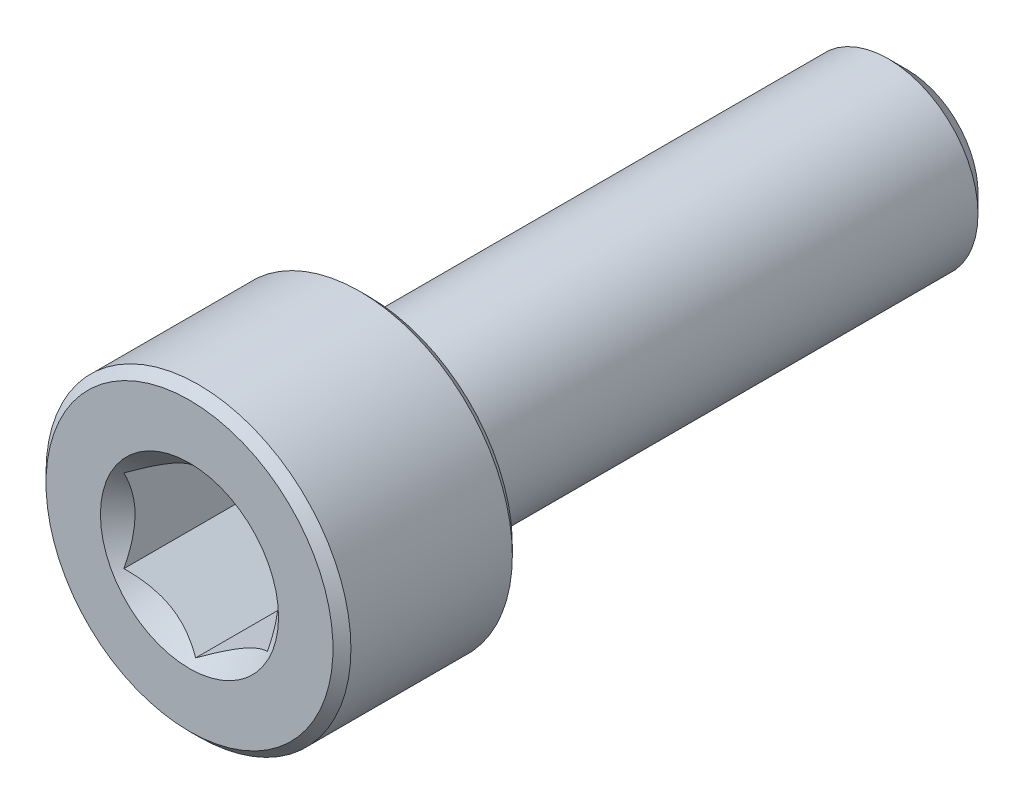
ISO-10303-21;
HEADER;
FILE_DESCRIPTION(('STEP AP214'),'2;1');
FILE_NAME('part.step','',(''),(''),'','','');
FILE_SCHEMA(('AUTOMOTIVE_DESIGN { 1 0 10303 214 1 1 1 1 }'));
ENDSEC;
DATA;
#1=APPLICATION_CONTEXT('core data for automotive mechanical design processes');
#2=APPLICATION_PROTOCOL_DEFINITION('international standard','automotive_design',2000,#1);
#3=PRODUCT_CONTEXT('',#1,'mechanical');
#4=PRODUCT('Part','Part','',(#3));
#5=PRODUCT_RELATED_PRODUCT_CATEGORY('part','',(#4));
#6=PRODUCT_DEFINITION_FORMATION('','',#4);
#7=PRODUCT_DEFINITION_CONTEXT('part definition',#1,'design');
#8=PRODUCT_DEFINITION('design','',#6,#7);
#9=PRODUCT_DEFINITION_SHAPE('','',#8);
#10=(LENGTH_UNIT() NAMED_UNIT(*) SI_UNIT(.MILLI.,.METRE.));
#11=(NAMED_UNIT(*) PLANE_ANGLE_UNIT() SI_UNIT($,.RADIAN.));
#12=(NAMED_UNIT(*) SI_UNIT($,.STERADIAN.) SOLID_ANGLE_UNIT());
#13=UNCERTAINTY_MEASURE_WITH_UNIT(LENGTH_MEASURE(1.E-05),#10,'distance_accuracy_value','');
#14=(GEOMETRIC_REPRESENTATION_CONTEXT(3) GLOBAL_UNCERTAINTY_ASSIGNED_CONTEXT((#13)) GLOBAL_UNIT_ASSIGNED_CONTEXT((#10,
#11,#12)) REPRESENTATION_CONTEXT('',''));
#15=CARTESIAN_POINT('',(0.,0.,0.));
#16=DIRECTION('',(0.,0.,1.));
#17=DIRECTION('',(1.,0.,0.));
#18=AXIS2_PLACEMENT_3D('',#15,#16,#17);
#19=CARTESIAN_POINT('',(0.,1.98038475772934,-10.));
#20=DIRECTION('',(0.,0.,-1.));
#21=DIRECTION('',(0.,1.,0.));
#22=AXIS2_PLACEMENT_3D('',#19,#20,#21);
#23=PLANE('',#22);
#24=CARTESIAN_POINT('',(0.,0.,-10.));
#25=DIRECTION('',(0.,0.,-1.));
#26=DIRECTION('',(0.,1.,0.));
#27=AXIS2_PLACEMENT_3D('',#24,#25,#26);
#28=CIRCLE('',#27,1.98038475772934);
#29=CARTESIAN_POINT('',(0.,1.98038475772934,-10.));
#30=VERTEX_POINT('',#29);
#31=EDGE_CURVE('E52',#30,#30,#28,.T.);
#32=ORIENTED_EDGE('',*,*,#31,.T.);
#33=EDGE_LOOP('',(#32));
#34=FACE_BOUND('',#33,.T.);
#35=ADVANCED_FACE('F39',(#34),#23,.T.);
#36=CARTESIAN_POINT('',(0.,0.,-10.));
#37=DIRECTION('',(0.,0.,1.));
#38=DIRECTION('',(0.,-1.,0.));
#39=AXIS2_PLACEMENT_3D('',#36,#37,#38);
#40=CONICAL_SURFACE('',#39,1.98038475772934,0.785398163397445);
#41=CARTESIAN_POINT('',(0.,0.,-9.48038475772933));
#42=DIRECTION('',(0.,0.,-1.));
#43=DIRECTION('',(0.,1.,0.));
#44=AXIS2_PLACEMENT_3D('',#41,#42,#43);
#45=CIRCLE('',#44,2.5);
#46=CARTESIAN_POINT('',(0.,2.5,-9.48038475772933));
#47=VERTEX_POINT('',#46);
#48=EDGE_CURVE('E155',#47,#47,#45,.T.);
#49=ORIENTED_EDGE('',*,*,#48,.T.);
#50=EDGE_LOOP('',(#49));
#51=FACE_BOUND('',#50,.T.);
#52=ORIENTED_EDGE('',*,*,#31,.F.);
#53=EDGE_LOOP('',(#52));
#54=FACE_BOUND('',#53,.T.);
#55=ADVANCED_FACE('F161',(#51,#54),#40,.T.);
#56=CARTESIAN_POINT('',(0.,0.,-10.));
#57=DIRECTION('',(0.,0.,-1.));
#58=DIRECTION('',(0.,1.,0.));
#59=AXIS2_PLACEMENT_3D('',#56,#57,#58);
#60=CYLINDRICAL_SURFACE('',#59,2.5);
#61=CARTESIAN_POINT('',(0.,0.,4.75));
#62=DIRECTION('',(0.,0.,-1.));
#63=DIRECTION('',(0.,1.,0.));
#64=AXIS2_PLACEMENT_3D('',#61,#62,#63);
#65=CIRCLE('',#64,2.5);
#66=CARTESIAN_POINT('',(0.,2.5,4.75));
#67=VERTEX_POINT('',#66);
#68=EDGE_CURVE('E152',#67,#67,#65,.T.);
#69=ORIENTED_EDGE('',*,*,#68,.T.);
#70=EDGE_LOOP('',(#69));
#71=FACE_BOUND('',#70,.T.);
#72=ORIENTED_EDGE('',*,*,#48,.F.);
#73=EDGE_LOOP('',(#72));
#74=FACE_BOUND('',#73,.T.);
#75=ADVANCED_FACE('F163',(#71,#74),#60,.T.);
#76=CARTESIAN_POINT('',(0.,0.,4.75));
#77=DIRECTION('',(0.,0.,-1.));
#78=DIRECTION('',(0.,1.,0.));
#79=AXIS2_PLACEMENT_3D('',#76,#77,#78);
#80=TOROIDAL_SURFACE('',#79,2.75,0.25);
#81=CARTESIAN_POINT('',(0.,0.,5.));
#82=DIRECTION('',(0.,0.,-1.));
#83=DIRECTION('',(0.,1.,0.));
#84=AXIS2_PLACEMENT_3D('',#81,#82,#83);
#85=CIRCLE('',#84,2.75);
#86=CARTESIAN_POINT('',(0.,2.75,5.));
#87=VERTEX_POINT('',#86);
#88=EDGE_CURVE('E149',#87,#87,#85,.T.);
#89=ORIENTED_EDGE('',*,*,#88,.T.);
#90=EDGE_LOOP('',(#89));
#91=FACE_BOUND('',#90,.T.);
#92=ORIENTED_EDGE('',*,*,#68,.F.);
#93=EDGE_LOOP('',(#92));
#94=FACE_BOUND('',#93,.T.);
#95=ADVANCED_FACE('F169',(#91,#94),#80,.F.);
#96=CARTESIAN_POINT('',(0.,4.,5.));
#97=DIRECTION('',(0.,0.,-1.));
#98=DIRECTION('',(0.,1.,0.));
#99=AXIS2_PLACEMENT_3D('',#96,#97,#98);
#100=PLANE('',#99);
#101=CARTESIAN_POINT('',(0.,0.,5.));
#102=DIRECTION('',(0.,0.,-1.));
#103=DIRECTION('',(0.,1.,0.));
#104=AXIS2_PLACEMENT_3D('',#101,#102,#103);
#105=CIRCLE('',#104,4.);
#106=CARTESIAN_POINT('',(0.,4.,5.));
#107=VERTEX_POINT('',#106);
#108=EDGE_CURVE('E146',#107,#107,#105,.T.);
#109=ORIENTED_EDGE('',*,*,#108,.T.);
#110=EDGE_LOOP('',(#109));
#111=FACE_BOUND('',#110,.T.);
#112=ORIENTED_EDGE('',*,*,#88,.F.);
#113=EDGE_LOOP('',(#112));
#114=FACE_BOUND('',#113,.T.);
#115=ADVANCED_FACE('F175',(#111,#114),#100,.T.);
#116=CARTESIAN_POINT('',(0.,0.,5.));
#117=DIRECTION('',(0.,0.,1.));
#118=DIRECTION('',(0.,-1.,0.));
#119=AXIS2_PLACEMENT_3D('',#116,#117,#118);
#120=CONICAL_SURFACE('',#119,4.,0.785398163397448);
#121=CARTESIAN_POINT('',(0.,0.,5.25));
#122=DIRECTION('',(0.,0.,-1.));
#123=DIRECTION('',(0.,1.,0.));
#124=AXIS2_PLACEMENT_3D('',#121,#122,#123);
#125=CIRCLE('',#124,4.25);
#126=CARTESIAN_POINT('',(0.,4.25,5.25));
#127=VERTEX_POINT('',#126);
#128=EDGE_CURVE('E143',#127,#127,#125,.T.);
#129=ORIENTED_EDGE('',*,*,#128,.T.);
#130=EDGE_LOOP('',(#129));
#131=FACE_BOUND('',#130,.T.);
#132=ORIENTED_EDGE('',*,*,#108,.F.);
#133=EDGE_LOOP('',(#132));
#134=FACE_BOUND('',#133,.T.);
#135=ADVANCED_FACE('F179',(#131,#134),#120,.T.);
#136=CARTESIAN_POINT('',(0.,0.,-10.));
#137=DIRECTION('',(0.,0.,-1.));
#138=DIRECTION('',(0.,1.,0.));
#139=AXIS2_PLACEMENT_3D('',#136,#137,#138);
#140=CYLINDRICAL_SURFACE('',#139,4.25);
#141=CARTESIAN_POINT('',(0.,0.,9.75));
#142=DIRECTION('',(0.,0.,-1.));
#143=DIRECTION('',(0.,1.,0.));
#144=AXIS2_PLACEMENT_3D('',#141,#142,#143);
#145=CIRCLE('',#144,4.25);
#146=CARTESIAN_POINT('',(0.,4.25,9.75));
#147=VERTEX_POINT('',#146);
#148=EDGE_CURVE('E140',#147,#147,#145,.T.);
#149=ORIENTED_EDGE('',*,*,#148,.T.);
#150=EDGE_LOOP('',(#149));
#151=FACE_BOUND('',#150,.T.);
#152=ORIENTED_EDGE('',*,*,#128,.F.);
#153=EDGE_LOOP('',(#152));
#154=FACE_BOUND('',#153,.T.);
#155=ADVANCED_FACE('F183',(#151,#154),#140,.T.);
#156=CARTESIAN_POINT('',(0.,0.,9.75));
#157=DIRECTION('',(0.,0.,-1.));
#158=DIRECTION('',(0.,1.,0.));
#159=AXIS2_PLACEMENT_3D('',#156,#157,#158);
#160=CONICAL_SURFACE('',#159,4.25,0.785398163397448);
#161=CARTESIAN_POINT('',(0.,0.,10.));
#162=DIRECTION('',(0.,0.,-1.));
#163=DIRECTION('',(0.,1.,0.));
#164=AXIS2_PLACEMENT_3D('',#161,#162,#163);
#165=CIRCLE('',#164,4.);
#166=CARTESIAN_POINT('',(0.,4.,10.));
#167=VERTEX_POINT('',#166);
#168=EDGE_CURVE('E137',#167,#167,#165,.T.);
#169=ORIENTED_EDGE('',*,*,#168,.T.);
#170=EDGE_LOOP('',(#169));
#171=FACE_BOUND('',#170,.T.);
#172=ORIENTED_EDGE('',*,*,#148,.F.);
#173=EDGE_LOOP('',(#172));
#174=FACE_BOUND('',#173,.T.);
#175=ADVANCED_FACE('F187',(#171,#174),#160,.T.);
#176=CARTESIAN_POINT('',(0.,0.,10.));
#177=DIRECTION('',(0.,0.,1.));
#178=DIRECTION('',(0.,-1.,0.));
#179=AXIS2_PLACEMENT_3D('',#176,#177,#178);
#180=PLANE('',#179);
#181=CARTESIAN_POINT('',(0.,0.,10.));
#182=DIRECTION('',(0.,0.,1.));
#183=DIRECTION('',(1.,0.,0.));
#184=AXIS2_PLACEMENT_3D('',#181,#182,#183);
#185=CIRCLE('',#184,2.48260615751539);
#186=CARTESIAN_POINT('',(2.48260615751539,0.,10.));
#187=VERTEX_POINT('',#186);
#188=EDGE_CURVE('E111',#187,#187,#185,.T.);
#189=ORIENTED_EDGE('',*,*,#188,.F.);
#190=EDGE_LOOP('',(#189));
#191=FACE_BOUND('',#190,.T.);
#192=ORIENTED_EDGE('',*,*,#168,.F.);
#193=EDGE_LOOP('',(#192));
#194=FACE_BOUND('',#193,.T.);
#195=ADVANCED_FACE('F191',(#191,#194),#180,.T.);
#196=CARTESIAN_POINT('',(0.,0.,10.));
#197=DIRECTION('',(0.,0.,1.));
#198=DIRECTION('',(1.,0.,0.));
#199=AXIS2_PLACEMENT_3D('',#196,#197,#198);
#200=CONICAL_SURFACE('',#199,2.48260615751539,0.78539816339745);
#201=ORIENTED_EDGE('',*,*,#188,.T.);
#202=EDGE_LOOP('',(#201));
#203=FACE_BOUND('',#202,.T.);
#204=CARTESIAN_POINT('',(-0.000199999999998729,-2.30951654681234,9.82691039795677));
#205=CARTESIAN_POINT('',(0.068553034030707,-2.26982196410711,9.7872480094687));
#206=CARTESIAN_POINT('',(0.138455742135513,-2.22946361676572,9.74991490152727));
#207=CARTESIAN_POINT('',(0.280995244550438,-2.1471683966763,9.68155860437926));
#208=CARTESIAN_POINT('',(0.35364559756536,-2.10522369580642,9.65057345298033));
#209=CARTESIAN_POINT('',(0.500141601053973,-2.02064418875706,9.59749513578726));
#210=CARTESIAN_POINT('',(0.573949935246296,-1.97803092714269,9.57526854641972));
#211=CARTESIAN_POINT('',(0.723191631835266,-1.89186619344273,9.54102373591819));
#212=CARTESIAN_POINT('',(0.798620433918153,-1.84831735425552,9.52897994838725));
#213=CARTESIAN_POINT('',(0.928615500671081,-1.7732646674724,9.51811343114868));
#214=CARTESIAN_POINT('',(0.98301378397011,-1.74185780396625,9.51650467285308));
#215=CARTESIAN_POINT('',(1.09172145551969,-1.67909540053412,9.51921379684182));
#216=CARTESIAN_POINT('',(1.14603080592134,-1.64773988246021,9.52353375700109));
#217=CARTESIAN_POINT('',(1.25413672758934,-1.5853248994842,9.53785448665302));
#218=CARTESIAN_POINT('',(1.30793265655479,-1.55426580541469,9.54786161200512));
#219=CARTESIAN_POINT('',(1.41459426230557,-1.49268469862228,9.57300734949277));
#220=CARTESIAN_POINT('',(1.46746001007071,-1.46216264491917,9.58814556828535));
#221=CARTESIAN_POINT('',(1.60287973308985,-1.38397803138049,9.6330894226723));
#222=CARTESIAN_POINT('',(1.68459383484948,-1.33680037273297,9.66628375866893));
#223=CARTESIAN_POINT('',(1.8047470372578,-1.26742988897853,9.72232074241448));
#224=CARTESIAN_POINT('',(1.84434285210918,-1.24456923461531,9.74200962219005));
#225=CARTESIAN_POINT('',(1.92280095888787,-1.19927142554652,9.78318223760798));
#226=CARTESIAN_POINT('',(1.96166368359374,-1.17683402097614,9.80466487089436));
#227=CARTESIAN_POINT('',(2.0002,-1.15458506832541,9.82691039795677));
#228=B_SPLINE_CURVE_WITH_KNOTS('',3,(#204,#205,#206,#207,#208,#209,#210,#211,#212,#213,#214,
#215,#216,#217,#218,#219,#220,#221,#222,#223,#224,#225,#226,#227),.UNSPECIFIED.,.F.,.F.,(4,2,2,
2,2,2,2,2,2,2,2,4),(0.,0.266420613771064,0.534393751523389,0.798110374376914,1.06116288956936,
1.24939906803722,1.43770123566247,1.62621426093932,1.81471283831913,2.11415604834145,
2.2634717071779,2.41269626969771),.UNSPECIFIED.);
#229=CARTESIAN_POINT('',(0.,-2.3094010767585,9.82679491924311));
#230=VERTEX_POINT('',#229);
#231=CARTESIAN_POINT('',(2.,-1.15470053837925,9.82679491924311));
#232=VERTEX_POINT('',#231);
#233=EDGE_CURVE('E12',#230,#232,#228,.T.);
#234=ORIENTED_EDGE('',*,*,#233,.F.);
#235=CARTESIAN_POINT('',(-2.0002,-1.15458506832541,9.82691039795677));
#236=CARTESIAN_POINT('',(-1.93144696596929,-1.19427965103064,9.7872480094687));
#237=CARTESIAN_POINT('',(-1.86154425786449,-1.23463799837204,9.74991490152727));
#238=CARTESIAN_POINT('',(-1.71900475544956,-1.31693321846145,9.68155860437925));
#239=CARTESIAN_POINT('',(-1.64635440243464,-1.35887791933134,9.65057345298033));
#240=CARTESIAN_POINT('',(-1.49985839894603,-1.44345742638069,9.59749513578725));
#241=CARTESIAN_POINT('',(-1.42605006475371,-1.48607068799507,9.57526854641972));
#242=CARTESIAN_POINT('',(-1.27680836816474,-1.57223542169503,9.54102373591819));
#243=CARTESIAN_POINT('',(-1.20137956608185,-1.61578426088223,9.52897994838725));
#244=CARTESIAN_POINT('',(-1.07138449932892,-1.69083694766536,9.51811343114868));
#245=CARTESIAN_POINT('',(-1.01698621602989,-1.72224381117151,9.51650467285308));
#246=CARTESIAN_POINT('',(-0.908278544480306,-1.78500621460364,9.51921379684182));
#247=CARTESIAN_POINT('',(-0.853969194078661,-1.81636173267754,9.52353375700109));
#248=CARTESIAN_POINT('',(-0.745863272410661,-1.87877671565355,9.53785448665302));
#249=CARTESIAN_POINT('',(-0.692067343445207,-1.90983580972306,9.54786161200512));
#250=CARTESIAN_POINT('',(-0.585405737694426,-1.97141691651547,9.57300734949277));
#251=CARTESIAN_POINT('',(-0.532539989929287,-2.00193897021859,9.58814556828535));
#252=CARTESIAN_POINT('',(-0.397120266910155,-2.08012358375727,9.6330894226723));
#253=CARTESIAN_POINT('',(-0.31540616515052,-2.12730124240478,9.66628375866893));
#254=CARTESIAN_POINT('',(-0.195252962742196,-2.19667172615922,9.72232074241448));
#255=CARTESIAN_POINT('',(-0.155657147890821,-2.21953238052245,9.74200962219005));
#256=CARTESIAN_POINT('',(-0.0771990411121266,-2.26483018959124,9.78318223760799));
#257=CARTESIAN_POINT('',(-0.0383363164062587,-2.28726759416161,9.80466487089436));
#258=CARTESIAN_POINT('',(0.000200000000001219,-2.30951654681234,9.82691039795677));
#259=B_SPLINE_CURVE_WITH_KNOTS('',3,(#235,#236,#237,#238,#239,#240,#241,#242,#243,#244,#245,
#246,#247,#248,#249,#250,#251,#252,#253,#254,#255,#256,#257,#258),.UNSPECIFIED.,.F.,.F.,(4,2,2,
2,2,2,2,2,2,2,2,4),(0.,0.266420613771064,0.534393751523389,0.798110374376915,1.06116288956936,
1.24939906803722,1.43770123566248,1.62621426093932,1.81471283831913,2.11415604834145,
2.26347170717791,2.41269626969771),.UNSPECIFIED.);
#260=CARTESIAN_POINT('',(-2.,-1.15470053837925,9.82679491924311));
#261=VERTEX_POINT('',#260);
#262=EDGE_CURVE('E97',#261,#230,#259,.T.);
#263=ORIENTED_EDGE('',*,*,#262,.F.);
#264=CARTESIAN_POINT('',(-2.,-2.42398175579868,10.6599545105457));
#265=CARTESIAN_POINT('',(-2.,-2.36547387630411,10.6148351758713));
#266=CARTESIAN_POINT('',(-2.,-2.30665236661135,10.5701161756265));
#267=CARTESIAN_POINT('',(-2.,-2.18825331969085,10.4816622121418));
#268=CARTESIAN_POINT('',(-2.,-2.12867560822125,10.4379274823771));
#269=CARTESIAN_POINT('',(-2.,-2.00820019262835,10.3513142462896));
#270=CARTESIAN_POINT('',(-2.,-1.94729585350119,10.3084449389484));
#271=CARTESIAN_POINT('',(-2.,-1.82447635639412,10.2241846501668));
#272=CARTESIAN_POINT('',(-2.,-1.76256126823391,10.1827935672392));
#273=CARTESIAN_POINT('',(-2.,-1.63352305153315,10.0992199648467));
#274=CARTESIAN_POINT('',(-2.,-1.56632133333278,10.0571581799355));
#275=CARTESIAN_POINT('',(-2.,-1.43035896394453,9.97563838893648));
#276=CARTESIAN_POINT('',(-2.,-1.3615985170145,9.93618004431012));
#277=CARTESIAN_POINT('',(-2.,-1.22246684398892,9.86068636376272));
#278=CARTESIAN_POINT('',(-2.,-1.15210085009344,9.82464146052515));
#279=CARTESIAN_POINT('',(-2.,-1.00937086384546,9.75678893834465));
#280=CARTESIAN_POINT('',(-2.,-0.937007838648202,9.724979310286));
#281=CARTESIAN_POINT('',(-2.,-0.797532850709096,9.66969189966866));
#282=CARTESIAN_POINT('',(-2.,-0.73062786798457,9.64569726163853));
#283=CARTESIAN_POINT('',(-2.,-0.595101218410189,9.60306213740658));
#284=CARTESIAN_POINT('',(-2.,-0.526479443554564,9.58442198898857));
#285=CARTESIAN_POINT('',(-2.,-0.389131528451131,9.55382052551661));
#286=CARTESIAN_POINT('',(-2.,-0.320433088583213,9.54173698158651));
#287=CARTESIAN_POINT('',(-2.,-0.182167175628636,9.52450292592166));
#288=CARTESIAN_POINT('',(-2.,-0.112599890436882,9.51935094051314));
#289=CARTESIAN_POINT('',(-2.,0.0235742388197043,9.51642612364862));
#290=CARTESIAN_POINT('',(-2.,0.090174262254322,9.51833341863494));
#291=CARTESIAN_POINT('',(-2.,0.222860647279179,9.52868442599921));
#292=CARTESIAN_POINT('',(-2.,0.288946962142557,9.537128726115));
#293=CARTESIAN_POINT('',(-2.,0.421249515605842,9.56021695445483));
#294=CARTESIAN_POINT('',(-2.,0.487446247340619,9.57497086973096));
#295=CARTESIAN_POINT('',(-2.,0.618375539180381,9.60985799828159));
#296=CARTESIAN_POINT('',(-2.,0.683108176846779,9.62999092587173));
#297=CARTESIAN_POINT('',(-2.,0.881750195572363,9.699485149858));
#298=CARTESIAN_POINT('',(-2.,1.01295821830486,9.75654000335251));
#299=CARTESIAN_POINT('',(-2.,1.26925973679032,9.88351839679612));
#300=CARTESIAN_POINT('',(-2.,1.39432972284545,9.95348716600114));
#301=CARTESIAN_POINT('',(-2.,1.57512870977373,10.0627644548654));
#302=CARTESIAN_POINT('',(-2.,1.63281357796872,10.0989012241787));
#303=CARTESIAN_POINT('',(-2.,1.74719269140407,10.1727216099303));
#304=CARTESIAN_POINT('',(-2.,1.80388686201493,10.2104053421917));
#305=CARTESIAN_POINT('',(-2.,1.91595826038669,10.2867305219709));
#306=CARTESIAN_POINT('',(-2.,1.97134240267412,10.3253618677048));
#307=CARTESIAN_POINT('',(-2.,2.08135060816028,10.4036615543687));
#308=CARTESIAN_POINT('',(-2.,2.13597487670731,10.4433296064566));
#309=CARTESIAN_POINT('',(-2.,2.19028039622782,10.4834228737147));
#310=B_SPLINE_CURVE_WITH_KNOTS('',3,(#264,#265,#266,#267,#268,#269,#270,#271,#272,#273,#274,
#275,#276,#277,#278,#279,#280,#281,#282,#283,#284,#285,#286,#287,#288,#289,#290,#291,#292,#293,
#294,#295,#296,#297,#298,#299,#300,#301,#302,#303,#304,#305,#306,#307,#308,#309),.UNSPECIFIED.,
.F.,.F.,(4,2,2,2,2,2,2,2,2,2,2,2,2,2,2,2,2,2,2,2,2,2,4),(0.,0.221657667100339,0.443367370127325,
0.666786125723386,0.890189512941441,1.12798201434515,1.36574353320624,1.60281759521649,
1.83977879106023,2.05282811904838,2.26589088413717,2.47483185958037,2.68372840641278,
2.88327763021218,3.08284479743513,3.28604242448891,3.48922926167214,3.91721633282416,
4.34673183999753,4.55091998635568,4.75512344852471,4.95768958131487,5.1601998654356),.UNSPECIFIED.);
#311=CARTESIAN_POINT('',(-2.,1.15470053837925,9.82679491924311));
#312=VERTEX_POINT('',#311);
#313=EDGE_CURVE('E110',#312,#261,#310,.F.);
#314=ORIENTED_EDGE('',*,*,#313,.F.);
#315=CARTESIAN_POINT('',(0.000199999999999905,2.30951654681234,9.82691039795677));
#316=CARTESIAN_POINT('',(-0.0685530340307056,2.26982196410711,9.7872480094687));
#317=CARTESIAN_POINT('',(-0.138455742135512,2.22946361676572,9.74991490152727));
#318=CARTESIAN_POINT('',(-0.280995244550437,2.1471683966763,9.68155860437925));
#319=CARTESIAN_POINT('',(-0.353645597565359,2.10522369580642,9.65057345298033));
#320=CARTESIAN_POINT('',(-0.500141601053972,2.02064418875706,9.59749513578725));
#321=CARTESIAN_POINT('',(-0.573949935246295,1.97803092714269,9.57526854641972));
#322=CARTESIAN_POINT('',(-0.723191631835265,1.89186619344273,9.54102373591819));
#323=CARTESIAN_POINT('',(-0.798620433918154,1.84831735425552,9.52897994838725));
#324=CARTESIAN_POINT('',(-0.928615500671081,1.77326466747239,9.51811343114868));
#325=CARTESIAN_POINT('',(-0.983013783970111,1.74185780396625,9.51650467285308));
#326=CARTESIAN_POINT('',(-1.0917214555197,1.67909540053412,9.51921379684182));
#327=CARTESIAN_POINT('',(-1.14603080592134,1.64773988246021,9.52353375700109));
#328=CARTESIAN_POINT('',(-1.25413672758934,1.5853248994842,9.53785448665302));
#329=CARTESIAN_POINT('',(-1.30793265655479,1.55426580541469,9.54786161200512));
#330=CARTESIAN_POINT('',(-1.41459426230558,1.49268469862228,9.57300734949277));
#331=CARTESIAN_POINT('',(-1.46746001007071,1.46216264491916,9.58814556828535));
#332=CARTESIAN_POINT('',(-1.60287973308985,1.38397803138048,9.6330894226723));
#333=CARTESIAN_POINT('',(-1.68459383484948,1.33680037273297,9.66628375866893));
#334=CARTESIAN_POINT('',(-1.8047470372578,1.26742988897853,9.72232074241448));
#335=CARTESIAN_POINT('',(-1.84434285210918,1.24456923461531,9.74200962219005));
#336=CARTESIAN_POINT('',(-1.92280095888787,1.19927142554652,9.78318223760798));
#337=CARTESIAN_POINT('',(-1.96166368359374,1.17683402097614,9.80466487089436));
#338=CARTESIAN_POINT('',(-2.0002,1.15458506832541,9.82691039795677));
#339=B_SPLINE_CURVE_WITH_KNOTS('',3,(#315,#316,#317,#318,#319,#320,#321,#322,#323,#324,#325,
#326,#327,#328,#329,#330,#331,#332,#333,#334,#335,#336,#337,#338),.UNSPECIFIED.,.F.,.F.,(4,2,2,
2,2,2,2,2,2,2,2,4),(0.,0.266420613771065,0.53439375152339,0.798110374376916,1.06116288956937,
1.24939906803722,1.43770123566248,1.62621426093932,1.81471283831914,2.11415604834145,
2.2634717071779,2.41269626969771),.UNSPECIFIED.);
#340=CARTESIAN_POINT('',(0.,2.3094010767585,9.82679491924311));
#341=VERTEX_POINT('',#340);
#342=EDGE_CURVE('E241',#341,#312,#339,.T.);
#343=ORIENTED_EDGE('',*,*,#342,.F.);
#344=CARTESIAN_POINT('',(2.0002,1.15458506832541,9.82691039795677));
#345=CARTESIAN_POINT('',(1.93144696596929,1.19427965103065,9.7872480094687));
#346=CARTESIAN_POINT('',(1.86154425786449,1.23463799837204,9.74991490152728));
#347=CARTESIAN_POINT('',(1.71900475544956,1.31693321846145,9.68155860437926));
#348=CARTESIAN_POINT('',(1.64635440243464,1.35887791933134,9.65057345298033));
#349=CARTESIAN_POINT('',(1.49985839894603,1.44345742638069,9.59749513578725));
#350=CARTESIAN_POINT('',(1.4260500647537,1.48607068799507,9.57526854641972));
#351=CARTESIAN_POINT('',(1.27680836816473,1.57223542169503,9.54102373591819));
#352=CARTESIAN_POINT('',(1.20137956608185,1.61578426088223,9.52897994838725));
#353=CARTESIAN_POINT('',(1.07138449932892,1.69083694766536,9.51811343114868));
#354=CARTESIAN_POINT('',(1.01698621602989,1.72224381117151,9.51650467285308));
#355=CARTESIAN_POINT('',(0.908278544480304,1.78500621460364,9.51921379684182));
#356=CARTESIAN_POINT('',(0.853969194078658,1.81636173267754,9.52353375700109));
#357=CARTESIAN_POINT('',(0.745863272410659,1.87877671565355,9.53785448665302));
#358=CARTESIAN_POINT('',(0.692067343445205,1.90983580972306,9.54786161200512));
#359=CARTESIAN_POINT('',(0.585405737694424,1.97141691651548,9.57300734949277));
#360=CARTESIAN_POINT('',(0.532539989929285,2.00193897021859,9.58814556828535));
#361=CARTESIAN_POINT('',(0.397120266910154,2.08012358375727,9.63308942267231));
#362=CARTESIAN_POINT('',(0.31540616515052,2.12730124240478,9.66628375866893));
#363=CARTESIAN_POINT('',(0.195252962742197,2.19667172615922,9.72232074241448));
#364=CARTESIAN_POINT('',(0.155657147890822,2.21953238052245,9.74200962219005));
#365=CARTESIAN_POINT('',(0.0771990411121276,2.26483018959124,9.78318223760798));
#366=CARTESIAN_POINT('',(0.0383363164062598,2.28726759416161,9.80466487089436));
#367=CARTESIAN_POINT('',(-0.000199999999999916,2.30951654681234,9.82691039795677));
#368=B_SPLINE_CURVE_WITH_KNOTS('',3,(#344,#345,#346,#347,#348,#349,#350,#351,#352,#353,#354,
#355,#356,#357,#358,#359,#360,#361,#362,#363,#364,#365,#366,#367),.UNSPECIFIED.,.F.,.F.,(4,2,2,
2,2,2,2,2,2,2,2,4),(0.,0.266420613771064,0.53439375152339,0.798110374376916,1.06116288956937,
1.24939906803722,1.43770123566248,1.62621426093932,1.81471283831914,2.11415604834145,
2.26347170717791,2.41269626969771),.UNSPECIFIED.);
#369=CARTESIAN_POINT('',(2.,1.15470053837925,9.82679491924311));
#370=VERTEX_POINT('',#369);
#371=EDGE_CURVE('E214',#370,#341,#368,.T.);
#372=ORIENTED_EDGE('',*,*,#371,.F.);
#373=CARTESIAN_POINT('',(2.,-2.42398175579868,10.6599545105457));
#374=CARTESIAN_POINT('',(2.,-2.3654738763041,10.6148351758713));
#375=CARTESIAN_POINT('',(2.,-2.30665236661135,10.5701161756265));
#376=CARTESIAN_POINT('',(2.,-2.18825331969085,10.4816622121418));
#377=CARTESIAN_POINT('',(2.,-2.12867560822125,10.4379274823771));
#378=CARTESIAN_POINT('',(2.,-2.00820019262835,10.3513142462896));
#379=CARTESIAN_POINT('',(2.,-1.94729585350119,10.3084449389484));
#380=CARTESIAN_POINT('',(2.,-1.82447635639412,10.2241846501668));
#381=CARTESIAN_POINT('',(2.,-1.76256126823391,10.1827935672392));
#382=CARTESIAN_POINT('',(2.,-1.63352305153315,10.0992199648467));
#383=CARTESIAN_POINT('',(2.,-1.56632133333278,10.0571581799355));
#384=CARTESIAN_POINT('',(2.,-1.43035896394453,9.97563838893648));
#385=CARTESIAN_POINT('',(2.,-1.3615985170145,9.93618004431012));
#386=CARTESIAN_POINT('',(2.,-1.22246684398892,9.86068636376272));
#387=CARTESIAN_POINT('',(2.,-1.15210085009344,9.82464146052515));
#388=CARTESIAN_POINT('',(2.,-1.00937086384545,9.75678893834465));
#389=CARTESIAN_POINT('',(2.,-0.937007838648201,9.724979310286));
#390=CARTESIAN_POINT('',(2.,-0.797532850709095,9.66969189966866));
#391=CARTESIAN_POINT('',(2.,-0.730627867984569,9.64569726163853));
#392=CARTESIAN_POINT('',(2.,-0.595101218410188,9.60306213740658));
#393=CARTESIAN_POINT('',(2.,-0.526479443554564,9.58442198898857));
#394=CARTESIAN_POINT('',(2.,-0.389131528451131,9.55382052551661));
#395=CARTESIAN_POINT('',(2.,-0.320433088583214,9.54173698158651));
#396=CARTESIAN_POINT('',(2.,-0.182167175628637,9.52450292592166));
#397=CARTESIAN_POINT('',(2.,-0.112599890436883,9.51935094051314));
#398=CARTESIAN_POINT('',(2.,0.0235742388197037,9.51642612364862));
#399=CARTESIAN_POINT('',(2.,0.0901742622543217,9.51833341863494));
#400=CARTESIAN_POINT('',(2.,0.222860647279179,9.52868442599921));
#401=CARTESIAN_POINT('',(2.,0.288946962142557,9.537128726115));
#402=CARTESIAN_POINT('',(2.,0.421249515605842,9.56021695445483));
#403=CARTESIAN_POINT('',(2.,0.487446247340619,9.57497086973097));
#404=CARTESIAN_POINT('',(2.,0.61837553918038,9.60985799828159));
#405=CARTESIAN_POINT('',(2.,0.683108176846778,9.62999092587173));
#406=CARTESIAN_POINT('',(2.,0.881750195572363,9.699485149858));
#407=CARTESIAN_POINT('',(2.,1.01295821830486,9.75654000335251));
#408=CARTESIAN_POINT('',(2.,1.26925973679032,9.88351839679612));
#409=CARTESIAN_POINT('',(2.,1.39432972284545,9.95348716600114));
#410=CARTESIAN_POINT('',(2.,1.57512870977373,10.0627644548654));
#411=CARTESIAN_POINT('',(2.,1.63281357796872,10.0989012241787));
#412=CARTESIAN_POINT('',(2.,1.74719269140407,10.1727216099303));
#413=CARTESIAN_POINT('',(2.,1.80388686201493,10.2104053421917));
#414=CARTESIAN_POINT('',(2.,1.91595826038669,10.2867305219709));
#415=CARTESIAN_POINT('',(2.,1.97134240267412,10.3253618677048));
#416=CARTESIAN_POINT('',(2.,2.08135060816028,10.4036615543687));
#417=CARTESIAN_POINT('',(2.,2.13597487670731,10.4433296064566));
#418=CARTESIAN_POINT('',(2.,2.19028039622781,10.4834228737147));
#419=B_SPLINE_CURVE_WITH_KNOTS('',3,(#373,#374,#375,#376,#377,#378,#379,#380,#381,#382,#383,
#384,#385,#386,#387,#388,#389,#390,#391,#392,#393,#394,#395,#396,#397,#398,#399,#400,#401,#402,
#403,#404,#405,#406,#407,#408,#409,#410,#411,#412,#413,#414,#415,#416,#417,#418),.UNSPECIFIED.,
.F.,.F.,(4,2,2,2,2,2,2,2,2,2,2,2,2,2,2,2,2,2,2,2,2,2,4),(0.,0.221657667100339,0.443367370127324,
0.666786125723386,0.89018951294144,1.12798201434515,1.36574353320624,1.60281759521649,
1.83977879106023,2.05282811904838,2.26589088413717,2.47483185958037,2.68372840641278,
2.88327763021218,3.08284479743513,3.28604242448891,3.48922926167214,3.91721633282416,
4.34673183999753,4.55091998635569,4.75512344852471,4.95768958131487,5.1601998654356),.UNSPECIFIED.);
#420=EDGE_CURVE('E59',#232,#370,#419,.T.);
#421=ORIENTED_EDGE('',*,*,#420,.F.);
#422=EDGE_LOOP('',(#234,#263,#314,#343,#372,#421));
#423=FACE_BOUND('',#422,.T.);
#424=ADVANCED_FACE('F96',(#203,#423),#200,.F.);
#425=CARTESIAN_POINT('',(0.,4.,6.));
#426=DIRECTION('',(0.,0.,-1.));
#427=DIRECTION('',(0.,1.,0.));
#428=AXIS2_PLACEMENT_3D('',#425,#426,#427);
#429=PLANE('',#428);
#430=DIRECTION('',(0.866025403784439,0.5,0.));
#431=VECTOR('',#430,1.);
#432=CARTESIAN_POINT('',(0.,-2.3094010767585,6.));
#433=LINE('',#432,#431);
#434=CARTESIAN_POINT('',(0.,-2.3094010767585,6.));
#435=VERTEX_POINT('',#434);
#436=CARTESIAN_POINT('',(2.,-1.15470053837925,6.));
#437=VERTEX_POINT('',#436);
#438=EDGE_CURVE('E114',#435,#437,#433,.T.);
#439=ORIENTED_EDGE('',*,*,#438,.T.);
#440=DIRECTION('',(0.,1.,0.));
#441=VECTOR('',#440,1.);
#442=CARTESIAN_POINT('',(2.,-1.15470053837925,6.));
#443=LINE('',#442,#441);
#444=CARTESIAN_POINT('',(2.,1.15470053837925,6.));
#445=VERTEX_POINT('',#444);
#446=EDGE_CURVE('E66',#437,#445,#443,.T.);
#447=ORIENTED_EDGE('',*,*,#446,.T.);
#448=DIRECTION('',(-0.866025403784439,0.5,0.));
#449=VECTOR('',#448,1.);
#450=CARTESIAN_POINT('',(2.,1.15470053837925,6.));
#451=LINE('',#450,#449);
#452=CARTESIAN_POINT('',(0.,2.3094010767585,6.));
#453=VERTEX_POINT('',#452);
#454=EDGE_CURVE('E122',#445,#453,#451,.T.);
#455=ORIENTED_EDGE('',*,*,#454,.T.);
#456=DIRECTION('',(-0.866025403784438,-0.5,0.));
#457=VECTOR('',#456,1.);
#458=CARTESIAN_POINT('',(0.,2.3094010767585,6.));
#459=LINE('',#458,#457);
#460=CARTESIAN_POINT('',(-2.,1.15470053837925,6.));
#461=VERTEX_POINT('',#460);
#462=EDGE_CURVE('E129',#453,#461,#459,.T.);
#463=ORIENTED_EDGE('',*,*,#462,.T.);
#464=DIRECTION('',(0.,-1.,0.));
#465=VECTOR('',#464,1.);
#466=CARTESIAN_POINT('',(-2.,1.15470053837925,6.));
#467=LINE('',#466,#465);
#468=CARTESIAN_POINT('',(-2.,-1.15470053837925,6.));
#469=VERTEX_POINT('',#468);
#470=EDGE_CURVE('E125',#461,#469,#467,.T.);
#471=ORIENTED_EDGE('',*,*,#470,.T.);
#472=DIRECTION('',(0.866025403784439,-0.5,0.));
#473=VECTOR('',#472,1.);
#474=CARTESIAN_POINT('',(-2.,-1.15470053837925,6.));
#475=LINE('',#474,#473);
#476=EDGE_CURVE('E115',#469,#435,#475,.T.);
#477=ORIENTED_EDGE('',*,*,#476,.T.);
#478=EDGE_LOOP('',(#439,#447,#455,#463,#471,#477));
#479=FACE_BOUND('',#478,.T.);
#480=ADVANCED_FACE('F196',(#479),#429,.F.);
#481=CARTESIAN_POINT('',(0.,-2.3094010767585,-1.11010092660779));
#482=DIRECTION('',(0.5,-0.866025403784438,0.));
#483=DIRECTION('',(0.866025403784439,0.5,0.));
#484=AXIS2_PLACEMENT_3D('',#481,#482,#483);
#485=PLANE('',#484);
#486=DIRECTION('',(0.,0.,1.));
#487=VECTOR('',#486,1.);
#488=CARTESIAN_POINT('',(0.,-2.3094010767585,-1.11010092660779));
#489=LINE('',#488,#487);
#490=EDGE_CURVE('E106',#435,#230,#489,.T.);
#491=ORIENTED_EDGE('',*,*,#490,.T.);
#492=ORIENTED_EDGE('',*,*,#233,.T.);
#493=DIRECTION('',(0.,0.,1.));
#494=VECTOR('',#493,1.);
#495=CARTESIAN_POINT('',(2.,-1.15470053837925,-1.11010092660779));
#496=LINE('',#495,#494);
#497=EDGE_CURVE('E117',#437,#232,#496,.T.);
#498=ORIENTED_EDGE('',*,*,#497,.F.);
#499=ORIENTED_EDGE('',*,*,#438,.F.);
#500=EDGE_LOOP('',(#491,#492,#498,#499));
#501=FACE_BOUND('',#500,.T.);
#502=ADVANCED_FACE('F113',(#501),#485,.F.);
#503=CARTESIAN_POINT('',(-2.,-1.15470053837925,-1.11010092660779));
#504=DIRECTION('',(-0.5,-0.866025403784438,0.));
#505=DIRECTION('',(0.866025403784439,-0.5,0.));
#506=AXIS2_PLACEMENT_3D('',#503,#504,#505);
#507=PLANE('',#506);
#508=DIRECTION('',(0.,0.,1.));
#509=VECTOR('',#508,1.);
#510=CARTESIAN_POINT('',(-2.,-1.15470053837925,-1.11010092660779));
#511=LINE('',#510,#509);
#512=EDGE_CURVE('E109',#469,#261,#511,.T.);
#513=ORIENTED_EDGE('',*,*,#512,.T.);
#514=ORIENTED_EDGE('',*,*,#262,.T.);
#515=ORIENTED_EDGE('',*,*,#490,.F.);
#516=ORIENTED_EDGE('',*,*,#476,.F.);
#517=EDGE_LOOP('',(#513,#514,#515,#516));
#518=FACE_BOUND('',#517,.T.);
#519=ADVANCED_FACE('F105',(#518),#507,.F.);
#520=CARTESIAN_POINT('',(-2.,1.15470053837925,-1.11010092660779));
#521=DIRECTION('',(-1.,0.,0.));
#522=DIRECTION('',(0.,0.,1.));
#523=AXIS2_PLACEMENT_3D('',#520,#521,#522);
#524=PLANE('',#523);
#525=DIRECTION('',(0.,0.,1.));
#526=VECTOR('',#525,1.);
#527=CARTESIAN_POINT('',(-2.,1.15470053837925,-1.11010092660779));
#528=LINE('',#527,#526);
#529=EDGE_CURVE('E126',#461,#312,#528,.T.);
#530=ORIENTED_EDGE('',*,*,#529,.T.);
#531=ORIENTED_EDGE('',*,*,#313,.T.);
#532=ORIENTED_EDGE('',*,*,#512,.F.);
#533=ORIENTED_EDGE('',*,*,#470,.F.);
#534=EDGE_LOOP('',(#530,#531,#532,#533));
#535=FACE_BOUND('',#534,.T.);
#536=ADVANCED_FACE('F250',(#535),#524,.F.);
#537=CARTESIAN_POINT('',(0.,2.3094010767585,-1.11010092660779));
#538=DIRECTION('',(-0.5,0.866025403784438,0.));
#539=DIRECTION('',(-0.866025403784438,-0.5,0.));
#540=AXIS2_PLACEMENT_3D('',#537,#538,#539);
#541=PLANE('',#540);
#542=DIRECTION('',(0.,0.,1.));
#543=VECTOR('',#542,1.);
#544=CARTESIAN_POINT('',(0.,2.3094010767585,-1.11010092660779));
#545=LINE('',#544,#543);
#546=EDGE_CURVE('E130',#453,#341,#545,.T.);
#547=ORIENTED_EDGE('',*,*,#546,.T.);
#548=ORIENTED_EDGE('',*,*,#342,.T.);
#549=ORIENTED_EDGE('',*,*,#529,.F.);
#550=ORIENTED_EDGE('',*,*,#462,.F.);
#551=EDGE_LOOP('',(#547,#548,#549,#550));
#552=FACE_BOUND('',#551,.T.);
#553=ADVANCED_FACE('F247',(#552),#541,.F.);
#554=CARTESIAN_POINT('',(2.,1.15470053837925,-1.11010092660779));
#555=DIRECTION('',(0.5,0.866025403784439,0.));
#556=DIRECTION('',(-0.866025403784439,0.5,0.));
#557=AXIS2_PLACEMENT_3D('',#554,#555,#556);
#558=PLANE('',#557);
#559=DIRECTION('',(0.,0.,1.));
#560=VECTOR('',#559,1.);
#561=CARTESIAN_POINT('',(2.,1.15470053837925,-1.11010092660779));
#562=LINE('',#561,#560);
#563=EDGE_CURVE('E133',#445,#370,#562,.T.);
#564=ORIENTED_EDGE('',*,*,#563,.T.);
#565=ORIENTED_EDGE('',*,*,#371,.T.);
#566=ORIENTED_EDGE('',*,*,#546,.F.);
#567=ORIENTED_EDGE('',*,*,#454,.F.);
#568=EDGE_LOOP('',(#564,#565,#566,#567));
#569=FACE_BOUND('',#568,.T.);
#570=ADVANCED_FACE('F204',(#569),#558,.F.);
#571=CARTESIAN_POINT('',(2.,-1.15470053837925,-1.11010092660779));
#572=DIRECTION('',(1.,0.,0.));
#573=DIRECTION('',(0.,0.,-1.));
#574=AXIS2_PLACEMENT_3D('',#571,#572,#573);
#575=PLANE('',#574);
#576=ORIENTED_EDGE('',*,*,#497,.T.);
#577=ORIENTED_EDGE('',*,*,#420,.T.);
#578=ORIENTED_EDGE('',*,*,#563,.F.);
#579=ORIENTED_EDGE('',*,*,#446,.F.);
#580=EDGE_LOOP('',(#576,#577,#578,#579));
#581=FACE_BOUND('',#580,.T.);
#582=ADVANCED_FACE('F200',(#581),#575,.F.);
#583=CLOSED_SHELL('',(#35,#55,#75,#95,#115,#135,#155,#175,#195,#424,#480,#502,#519,#536,#553,
#570,#582));
#584=MANIFOLD_SOLID_BREP('B2',#583);
#585=ADVANCED_BREP_SHAPE_REPRESENTATION('',(#18,#584),#14);
#586=SHAPE_DEFINITION_REPRESENTATION(#9,#585);
ENDSEC;
END-ISO-10303-21;
